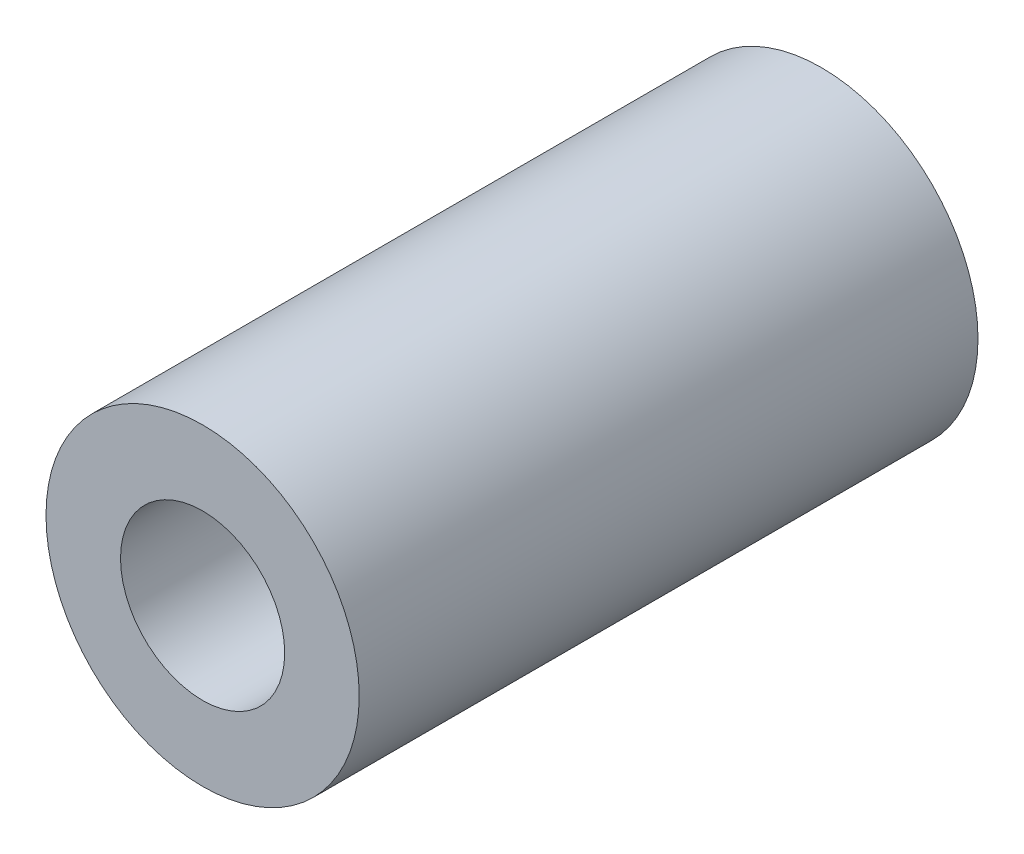
ISO-10303-21;
HEADER;
FILE_DESCRIPTION(('STEP AP214'),'2;1');
FILE_NAME('part.step','',(''),(''),'','','');
FILE_SCHEMA(('AUTOMOTIVE_DESIGN { 1 0 10303 214 1 1 1 1 }'));
ENDSEC;
DATA;
#1=APPLICATION_CONTEXT('core data for automotive mechanical design processes');
#2=APPLICATION_PROTOCOL_DEFINITION('international standard','automotive_design',2000,#1);
#3=PRODUCT_CONTEXT('',#1,'mechanical');
#4=PRODUCT('Part','Part','',(#3));
#5=PRODUCT_RELATED_PRODUCT_CATEGORY('part','',(#4));
#6=PRODUCT_DEFINITION_FORMATION('','',#4);
#7=PRODUCT_DEFINITION_CONTEXT('part definition',#1,'design');
#8=PRODUCT_DEFINITION('design','',#6,#7);
#9=PRODUCT_DEFINITION_SHAPE('','',#8);
#10=(LENGTH_UNIT() NAMED_UNIT(*) SI_UNIT(.MILLI.,.METRE.));
#11=(NAMED_UNIT(*) PLANE_ANGLE_UNIT() SI_UNIT($,.RADIAN.));
#12=(NAMED_UNIT(*) SI_UNIT($,.STERADIAN.) SOLID_ANGLE_UNIT());
#13=UNCERTAINTY_MEASURE_WITH_UNIT(LENGTH_MEASURE(1.E-05),#10,'distance_accuracy_value','');
#14=(GEOMETRIC_REPRESENTATION_CONTEXT(3) GLOBAL_UNCERTAINTY_ASSIGNED_CONTEXT((#13)) GLOBAL_UNIT_ASSIGNED_CONTEXT((#10,
#11,#12)) REPRESENTATION_CONTEXT('',''));
#15=CARTESIAN_POINT('',(0.,0.,0.));
#16=DIRECTION('',(0.,0.,1.));
#17=DIRECTION('',(1.,0.,0.));
#18=AXIS2_PLACEMENT_3D('',#15,#16,#17);
#19=CARTESIAN_POINT('',(0.,0.,6.223));
#20=DIRECTION('',(0.,0.,-1.));
#21=DIRECTION('',(-1.,0.,0.));
#22=AXIS2_PLACEMENT_3D('',#19,#20,#21);
#23=CYLINDRICAL_SURFACE('',#22,0.8255);
#24=CARTESIAN_POINT('',(0.,0.,6.223));
#25=DIRECTION('',(0.,0.,1.));
#26=DIRECTION('',(1.,0.,0.));
#27=AXIS2_PLACEMENT_3D('',#24,#25,#26);
#28=CIRCLE('',#27,0.8255);
#29=CARTESIAN_POINT('',(0.8255,0.,6.223));
#30=VERTEX_POINT('',#29);
#31=EDGE_CURVE('E41',#30,#30,#28,.T.);
#32=ORIENTED_EDGE('',*,*,#31,.T.);
#33=EDGE_LOOP('',(#32));
#34=FACE_BOUND('',#33,.T.);
#35=CARTESIAN_POINT('',(0.,0.,0.));
#36=DIRECTION('',(0.,0.,1.));
#37=DIRECTION('',(1.,0.,0.));
#38=AXIS2_PLACEMENT_3D('',#35,#36,#37);
#39=CIRCLE('',#38,0.8255);
#40=CARTESIAN_POINT('',(0.8255,0.,0.));
#41=VERTEX_POINT('',#40);
#42=EDGE_CURVE('E47',#41,#41,#39,.T.);
#43=ORIENTED_EDGE('',*,*,#42,.F.);
#44=EDGE_LOOP('',(#43));
#45=FACE_BOUND('',#44,.T.);
#46=ADVANCED_FACE('F34',(#34,#45),#23,.F.);
#47=CARTESIAN_POINT('',(0.,0.,6.223));
#48=DIRECTION('',(0.,0.,-1.));
#49=DIRECTION('',(-1.,0.,0.));
#50=AXIS2_PLACEMENT_3D('',#47,#48,#49);
#51=CYLINDRICAL_SURFACE('',#50,1.5748);
#52=CARTESIAN_POINT('',(0.,0.,6.223));
#53=DIRECTION('',(0.,0.,1.));
#54=DIRECTION('',(1.,0.,0.));
#55=AXIS2_PLACEMENT_3D('',#52,#53,#54);
#56=CIRCLE('',#55,1.5748);
#57=CARTESIAN_POINT('',(1.5748,0.,6.223));
#58=VERTEX_POINT('',#57);
#59=EDGE_CURVE('E10',#58,#58,#56,.T.);
#60=ORIENTED_EDGE('',*,*,#59,.F.);
#61=EDGE_LOOP('',(#60));
#62=FACE_BOUND('',#61,.T.);
#63=CARTESIAN_POINT('',(0.,0.,0.));
#64=DIRECTION('',(0.,0.,1.));
#65=DIRECTION('',(1.,0.,0.));
#66=AXIS2_PLACEMENT_3D('',#63,#64,#65);
#67=CIRCLE('',#66,1.5748);
#68=CARTESIAN_POINT('',(1.5748,0.,0.));
#69=VERTEX_POINT('',#68);
#70=EDGE_CURVE('E37',#69,#69,#67,.T.);
#71=ORIENTED_EDGE('',*,*,#70,.T.);
#72=EDGE_LOOP('',(#71));
#73=FACE_BOUND('',#72,.T.);
#74=ADVANCED_FACE('F54',(#62,#73),#51,.T.);
#75=CARTESIAN_POINT('',(0.,-3.60598135623731,6.223));
#76=DIRECTION('',(0.,0.,1.));
#77=DIRECTION('',(1.,0.,0.));
#78=AXIS2_PLACEMENT_3D('',#75,#76,#77);
#79=PLANE('',#78);
#80=ORIENTED_EDGE('',*,*,#31,.F.);
#81=EDGE_LOOP('',(#80));
#82=FACE_BOUND('',#81,.T.);
#83=ORIENTED_EDGE('',*,*,#59,.T.);
#84=EDGE_LOOP('',(#83));
#85=FACE_BOUND('',#84,.T.);
#86=ADVANCED_FACE('F58',(#82,#85),#79,.T.);
#87=CARTESIAN_POINT('',(0.,-3.60598135623731,0.));
#88=DIRECTION('',(0.,0.,1.));
#89=DIRECTION('',(1.,0.,0.));
#90=AXIS2_PLACEMENT_3D('',#87,#88,#89);
#91=PLANE('',#90);
#92=ORIENTED_EDGE('',*,*,#42,.T.);
#93=EDGE_LOOP('',(#92));
#94=FACE_BOUND('',#93,.T.);
#95=ORIENTED_EDGE('',*,*,#70,.F.);
#96=EDGE_LOOP('',(#95));
#97=FACE_BOUND('',#96,.T.);
#98=ADVANCED_FACE('F56',(#94,#97),#91,.F.);
#99=CLOSED_SHELL('',(#46,#74,#86,#98));
#100=MANIFOLD_SOLID_BREP('B2',#99);
#101=ADVANCED_BREP_SHAPE_REPRESENTATION('',(#18,#100),#14);
#102=SHAPE_DEFINITION_REPRESENTATION(#9,#101);
ENDSEC;
END-ISO-10303-21;
